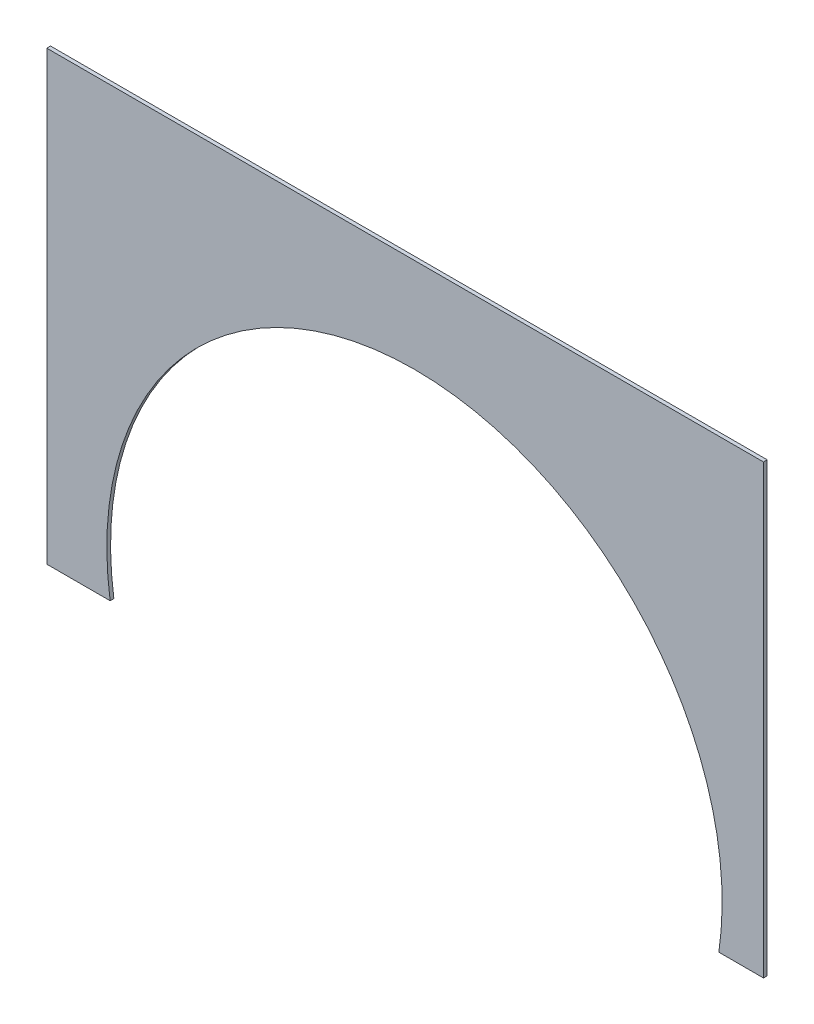
ISO-10303-21;
HEADER;
FILE_DESCRIPTION(('STEP AP214'),'2;1');
FILE_NAME('part.step','',(''),(''),'','','');
FILE_SCHEMA(('AUTOMOTIVE_DESIGN { 1 0 10303 214 1 1 1 1 }'));
ENDSEC;
DATA;
#1=APPLICATION_CONTEXT('core data for automotive mechanical design processes');
#2=APPLICATION_PROTOCOL_DEFINITION('international standard','automotive_design',2000,#1);
#3=PRODUCT_CONTEXT('',#1,'mechanical');
#4=PRODUCT('Part','Part','',(#3));
#5=PRODUCT_RELATED_PRODUCT_CATEGORY('part','',(#4));
#6=PRODUCT_DEFINITION_FORMATION('','',#4);
#7=PRODUCT_DEFINITION_CONTEXT('part definition',#1,'design');
#8=PRODUCT_DEFINITION('design','',#6,#7);
#9=PRODUCT_DEFINITION_SHAPE('','',#8);
#10=(LENGTH_UNIT() NAMED_UNIT(*) SI_UNIT(.MILLI.,.METRE.));
#11=(NAMED_UNIT(*) PLANE_ANGLE_UNIT() SI_UNIT($,.RADIAN.));
#12=(NAMED_UNIT(*) SI_UNIT($,.STERADIAN.) SOLID_ANGLE_UNIT());
#13=UNCERTAINTY_MEASURE_WITH_UNIT(LENGTH_MEASURE(1.E-05),#10,'distance_accuracy_value','');
#14=(GEOMETRIC_REPRESENTATION_CONTEXT(3) GLOBAL_UNCERTAINTY_ASSIGNED_CONTEXT((#13)) GLOBAL_UNIT_ASSIGNED_CONTEXT((#10,
#11,#12)) REPRESENTATION_CONTEXT('',''));
#15=CARTESIAN_POINT('',(0.,0.,0.));
#16=DIRECTION('',(0.,0.,1.));
#17=DIRECTION('',(1.,0.,0.));
#18=AXIS2_PLACEMENT_3D('',#15,#16,#17);
#19=CARTESIAN_POINT('',(2.06376218727655,0.,0.5));
#20=DIRECTION('',(1.,0.,0.));
#21=DIRECTION('',(0.,1.,0.));
#22=AXIS2_PLACEMENT_3D('',#19,#20,#21);
#23=PLANE('',#22);
#24=DIRECTION('',(0.,-1.,0.));
#25=VECTOR('',#24,1.);
#26=CARTESIAN_POINT('',(2.06376218727655,0.,0.));
#27=LINE('',#26,#25);
#28=CARTESIAN_POINT('',(2.06376218727655,0.,0.));
#29=VERTEX_POINT('',#28);
#30=CARTESIAN_POINT('',(2.06376218727656,-60.,0.));
#31=VERTEX_POINT('',#30);
#32=EDGE_CURVE('E115',#29,#31,#27,.T.);
#33=ORIENTED_EDGE('',*,*,#32,.T.);
#34=DIRECTION('',(0.,0.,-1.));
#35=VECTOR('',#34,1.);
#36=CARTESIAN_POINT('',(2.06376218727656,-60.,0.5));
#37=LINE('',#36,#35);
#38=CARTESIAN_POINT('',(2.06376218727656,-60.,0.5));
#39=VERTEX_POINT('',#38);
#40=EDGE_CURVE('E11',#39,#31,#37,.T.);
#41=ORIENTED_EDGE('',*,*,#40,.F.);
#42=DIRECTION('',(0.,-1.,0.));
#43=VECTOR('',#42,1.);
#44=CARTESIAN_POINT('',(2.06376218727655,0.,0.5));
#45=LINE('',#44,#43);
#46=CARTESIAN_POINT('',(2.06376218727655,0.,0.5));
#47=VERTEX_POINT('',#46);
#48=EDGE_CURVE('E125',#47,#39,#45,.T.);
#49=ORIENTED_EDGE('',*,*,#48,.F.);
#50=DIRECTION('',(0.,0.,-1.));
#51=VECTOR('',#50,1.);
#52=CARTESIAN_POINT('',(2.06376218727655,0.,0.5));
#53=LINE('',#52,#51);
#54=EDGE_CURVE('E111',#47,#29,#53,.T.);
#55=ORIENTED_EDGE('',*,*,#54,.T.);
#56=EDGE_LOOP('',(#33,#41,#49,#55));
#57=FACE_BOUND('',#56,.T.);
#58=ADVANCED_FACE('F31',(#57),#23,.F.);
#59=CARTESIAN_POINT('',(2.06376218727656,-60.,0.5));
#60=DIRECTION('',(0.,1.,0.));
#61=DIRECTION('',(0.,0.,1.));
#62=AXIS2_PLACEMENT_3D('',#59,#60,#61);
#63=PLANE('',#62);
#64=DIRECTION('',(1.,0.,0.));
#65=VECTOR('',#64,1.);
#66=CARTESIAN_POINT('',(2.06376218727656,-60.,0.));
#67=LINE('',#66,#65);
#68=CARTESIAN_POINT('',(10.5696567447118,-60.,0.));
#69=VERTEX_POINT('',#68);
#70=EDGE_CURVE('E118',#31,#69,#67,.T.);
#71=ORIENTED_EDGE('',*,*,#70,.T.);
#72=DIRECTION('',(0.,0.,-1.));
#73=VECTOR('',#72,1.);
#74=CARTESIAN_POINT('',(10.5696567447118,-60.,0.5));
#75=LINE('',#74,#73);
#76=CARTESIAN_POINT('',(10.5696567447118,-60.,0.5));
#77=VERTEX_POINT('',#76);
#78=EDGE_CURVE('E39',#77,#69,#75,.T.);
#79=ORIENTED_EDGE('',*,*,#78,.F.);
#80=DIRECTION('',(1.,0.,0.));
#81=VECTOR('',#80,1.);
#82=CARTESIAN_POINT('',(2.06376218727656,-60.,0.5));
#83=LINE('',#82,#81);
#84=EDGE_CURVE('E84',#39,#77,#83,.T.);
#85=ORIENTED_EDGE('',*,*,#84,.F.);
#86=ORIENTED_EDGE('',*,*,#40,.T.);
#87=EDGE_LOOP('',(#71,#79,#85,#86));
#88=FACE_BOUND('',#87,.T.);
#89=ADVANCED_FACE('F149',(#88),#63,.F.);
#90=CARTESIAN_POINT('',(51.4309251964903,-53.9681804440354,0.5));
#91=DIRECTION('',(0.,0.,-1.));
#92=DIRECTION('',(-1.,0.,0.));
#93=AXIS2_PLACEMENT_3D('',#90,#91,#92);
#94=CYLINDRICAL_SURFACE('',#93,41.3040688872661);
#95=CARTESIAN_POINT('',(51.4309251964903,-53.9681804440354,0.));
#96=DIRECTION('',(0.,0.,-1.));
#97=DIRECTION('',(1.,0.,0.));
#98=AXIS2_PLACEMENT_3D('',#95,#96,#97);
#99=CIRCLE('',#98,41.3040688872661);
#100=CARTESIAN_POINT('',(92.2921936482687,-60.,0.));
#101=VERTEX_POINT('',#100);
#102=EDGE_CURVE('E120',#69,#101,#99,.T.);
#103=ORIENTED_EDGE('',*,*,#102,.T.);
#104=DIRECTION('',(0.,0.,-1.));
#105=VECTOR('',#104,1.);
#106=CARTESIAN_POINT('',(92.2921936482687,-60.,0.5));
#107=LINE('',#106,#105);
#108=CARTESIAN_POINT('',(92.2921936482687,-60.,0.5));
#109=VERTEX_POINT('',#108);
#110=EDGE_CURVE('E106',#109,#101,#107,.T.);
#111=ORIENTED_EDGE('',*,*,#110,.F.);
#112=CARTESIAN_POINT('',(51.4309251964903,-53.9681804440354,0.5));
#113=DIRECTION('',(0.,0.,-1.));
#114=DIRECTION('',(1.,0.,0.));
#115=AXIS2_PLACEMENT_3D('',#112,#113,#114);
#116=CIRCLE('',#115,41.3040688872661);
#117=EDGE_CURVE('E97',#77,#109,#116,.T.);
#118=ORIENTED_EDGE('',*,*,#117,.F.);
#119=ORIENTED_EDGE('',*,*,#78,.T.);
#120=EDGE_LOOP('',(#103,#111,#118,#119));
#121=FACE_BOUND('',#120,.T.);
#122=ADVANCED_FACE('F131',(#121),#94,.F.);
#123=CARTESIAN_POINT('',(92.2921936482687,-60.,0.5));
#124=DIRECTION('',(0.,1.,0.));
#125=DIRECTION('',(0.,0.,1.));
#126=AXIS2_PLACEMENT_3D('',#123,#124,#125);
#127=PLANE('',#126);
#128=DIRECTION('',(1.,0.,0.));
#129=VECTOR('',#128,1.);
#130=CARTESIAN_POINT('',(92.2921936482687,-60.,0.));
#131=LINE('',#130,#129);
#132=CARTESIAN_POINT('',(98.2878699771206,-60.,0.));
#133=VERTEX_POINT('',#132);
#134=EDGE_CURVE('E105',#101,#133,#131,.T.);
#135=ORIENTED_EDGE('',*,*,#134,.T.);
#136=DIRECTION('',(0.,0.,-1.));
#137=VECTOR('',#136,1.);
#138=CARTESIAN_POINT('',(98.2878699771206,-60.,0.5));
#139=LINE('',#138,#137);
#140=CARTESIAN_POINT('',(98.2878699771206,-60.,0.5));
#141=VERTEX_POINT('',#140);
#142=EDGE_CURVE('E102',#141,#133,#139,.T.);
#143=ORIENTED_EDGE('',*,*,#142,.F.);
#144=DIRECTION('',(1.,0.,0.));
#145=VECTOR('',#144,1.);
#146=CARTESIAN_POINT('',(92.2921936482687,-60.,0.5));
#147=LINE('',#146,#145);
#148=EDGE_CURVE('E91',#109,#141,#147,.T.);
#149=ORIENTED_EDGE('',*,*,#148,.F.);
#150=ORIENTED_EDGE('',*,*,#110,.T.);
#151=EDGE_LOOP('',(#135,#143,#149,#150));
#152=FACE_BOUND('',#151,.T.);
#153=ADVANCED_FACE('F103',(#152),#127,.F.);
#154=CARTESIAN_POINT('',(98.2878699771206,0.,0.5));
#155=DIRECTION('',(-1.,0.,0.));
#156=DIRECTION('',(0.,-1.,0.));
#157=AXIS2_PLACEMENT_3D('',#154,#155,#156);
#158=PLANE('',#157);
#159=DIRECTION('',(0.,1.,0.));
#160=VECTOR('',#159,1.);
#161=CARTESIAN_POINT('',(98.2878699771206,0.,0.));
#162=LINE('',#161,#160);
#163=CARTESIAN_POINT('',(98.2878699771206,0.,0.));
#164=VERTEX_POINT('',#163);
#165=EDGE_CURVE('E70',#133,#164,#162,.T.);
#166=ORIENTED_EDGE('',*,*,#165,.T.);
#167=DIRECTION('',(0.,0.,-1.));
#168=VECTOR('',#167,1.);
#169=CARTESIAN_POINT('',(98.2878699771206,0.,0.5));
#170=LINE('',#169,#168);
#171=CARTESIAN_POINT('',(98.2878699771206,0.,0.5));
#172=VERTEX_POINT('',#171);
#173=EDGE_CURVE('E107',#172,#164,#170,.T.);
#174=ORIENTED_EDGE('',*,*,#173,.F.);
#175=DIRECTION('',(0.,1.,0.));
#176=VECTOR('',#175,1.);
#177=CARTESIAN_POINT('',(98.2878699771206,0.,0.5));
#178=LINE('',#177,#176);
#179=EDGE_CURVE('E95',#141,#172,#178,.T.);
#180=ORIENTED_EDGE('',*,*,#179,.F.);
#181=ORIENTED_EDGE('',*,*,#142,.T.);
#182=EDGE_LOOP('',(#166,#174,#180,#181));
#183=FACE_BOUND('',#182,.T.);
#184=ADVANCED_FACE('F109',(#183),#158,.F.);
#185=CARTESIAN_POINT('',(2.06376218727655,0.,0.5));
#186=DIRECTION('',(0.,-1.,0.));
#187=DIRECTION('',(0.,0.,-1.));
#188=AXIS2_PLACEMENT_3D('',#185,#186,#187);
#189=PLANE('',#188);
#190=DIRECTION('',(-1.,0.,0.));
#191=VECTOR('',#190,1.);
#192=CARTESIAN_POINT('',(2.06376218727655,0.,0.));
#193=LINE('',#192,#191);
#194=EDGE_CURVE('E76',#164,#29,#193,.T.);
#195=ORIENTED_EDGE('',*,*,#194,.T.);
#196=ORIENTED_EDGE('',*,*,#54,.F.);
#197=DIRECTION('',(-1.,0.,0.));
#198=VECTOR('',#197,1.);
#199=CARTESIAN_POINT('',(2.06376218727655,0.,0.5));
#200=LINE('',#199,#198);
#201=EDGE_CURVE('E47',#172,#47,#200,.T.);
#202=ORIENTED_EDGE('',*,*,#201,.F.);
#203=ORIENTED_EDGE('',*,*,#173,.T.);
#204=EDGE_LOOP('',(#195,#196,#202,#203));
#205=FACE_BOUND('',#204,.T.);
#206=ADVANCED_FACE('F138',(#205),#189,.F.);
#207=CARTESIAN_POINT('',(51.4309251964903,-53.9681804440354,0.5));
#208=DIRECTION('',(0.,0.,1.));
#209=DIRECTION('',(1.,0.,0.));
#210=AXIS2_PLACEMENT_3D('',#207,#208,#209);
#211=PLANE('',#210);
#212=ORIENTED_EDGE('',*,*,#48,.T.);
#213=ORIENTED_EDGE('',*,*,#84,.T.);
#214=ORIENTED_EDGE('',*,*,#117,.T.);
#215=ORIENTED_EDGE('',*,*,#148,.T.);
#216=ORIENTED_EDGE('',*,*,#179,.T.);
#217=ORIENTED_EDGE('',*,*,#201,.T.);
#218=EDGE_LOOP('',(#212,#213,#214,#215,#216,#217));
#219=FACE_BOUND('',#218,.T.);
#220=ADVANCED_FACE('F93',(#219),#211,.T.);
#221=CARTESIAN_POINT('',(51.4309251964903,-53.9681804440354,0.));
#222=DIRECTION('',(0.,0.,1.));
#223=DIRECTION('',(1.,0.,0.));
#224=AXIS2_PLACEMENT_3D('',#221,#222,#223);
#225=PLANE('',#224);
#226=ORIENTED_EDGE('',*,*,#32,.F.);
#227=ORIENTED_EDGE('',*,*,#194,.F.);
#228=ORIENTED_EDGE('',*,*,#165,.F.);
#229=ORIENTED_EDGE('',*,*,#134,.F.);
#230=ORIENTED_EDGE('',*,*,#102,.F.);
#231=ORIENTED_EDGE('',*,*,#70,.F.);
#232=EDGE_LOOP('',(#226,#227,#228,#229,#230,#231));
#233=FACE_BOUND('',#232,.T.);
#234=ADVANCED_FACE('F134',(#233),#225,.F.);
#235=CLOSED_SHELL('',(#58,#89,#122,#153,#184,#206,#220,#234));
#236=MANIFOLD_SOLID_BREP('B2',#235);
#237=ADVANCED_BREP_SHAPE_REPRESENTATION('',(#18,#236),#14);
#238=SHAPE_DEFINITION_REPRESENTATION(#9,#237);
ENDSEC;
END-ISO-10303-21;
